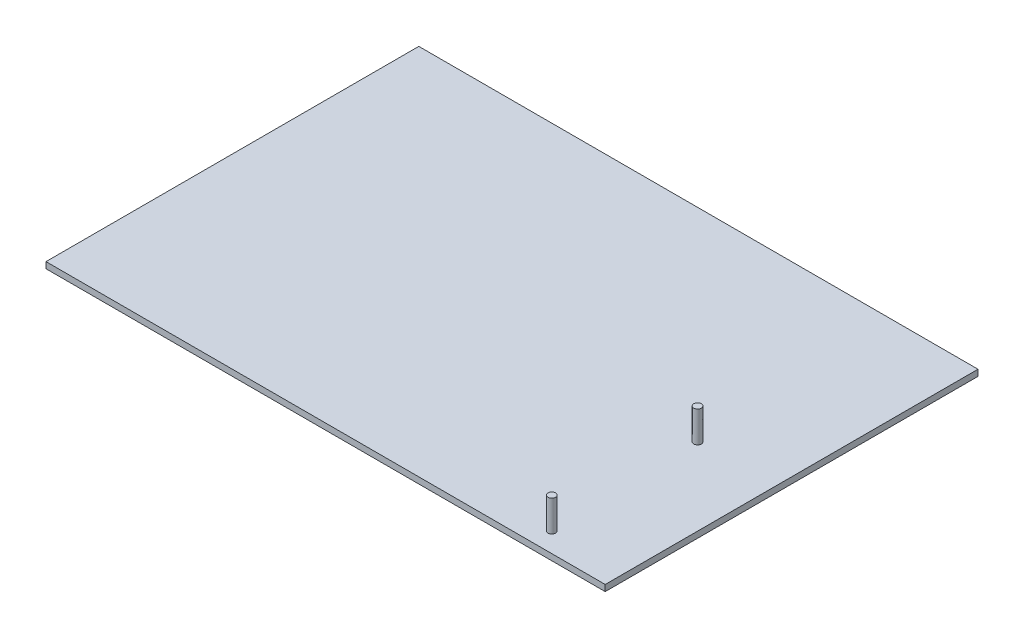
ISO-10303-21;
HEADER;
FILE_DESCRIPTION(('STEP AP214'),'2;1');
FILE_NAME('part.step','',(''),(''),'','','');
FILE_SCHEMA(('AUTOMOTIVE_DESIGN { 1 0 10303 214 1 1 1 1 }'));
ENDSEC;
DATA;
#1=APPLICATION_CONTEXT('core data for automotive mechanical design processes');
#2=APPLICATION_PROTOCOL_DEFINITION('international standard','automotive_design',2000,#1);
#3=PRODUCT_CONTEXT('',#1,'mechanical');
#4=PRODUCT('Part','Part','',(#3));
#5=PRODUCT_RELATED_PRODUCT_CATEGORY('part','',(#4));
#6=PRODUCT_DEFINITION_FORMATION('','',#4);
#7=PRODUCT_DEFINITION_CONTEXT('part definition',#1,'design');
#8=PRODUCT_DEFINITION('design','',#6,#7);
#9=PRODUCT_DEFINITION_SHAPE('','',#8);
#10=(LENGTH_UNIT() NAMED_UNIT(*) SI_UNIT(.MILLI.,.METRE.));
#11=(NAMED_UNIT(*) PLANE_ANGLE_UNIT() SI_UNIT($,.RADIAN.));
#12=(NAMED_UNIT(*) SI_UNIT($,.STERADIAN.) SOLID_ANGLE_UNIT());
#13=UNCERTAINTY_MEASURE_WITH_UNIT(LENGTH_MEASURE(1.E-05),#10,'distance_accuracy_value','');
#14=(GEOMETRIC_REPRESENTATION_CONTEXT(3) GLOBAL_UNCERTAINTY_ASSIGNED_CONTEXT((#13)) GLOBAL_UNIT_ASSIGNED_CONTEXT((#10,
#11,#12)) REPRESENTATION_CONTEXT('',''));
#15=CARTESIAN_POINT('',(0.,0.,0.));
#16=DIRECTION('',(0.,0.,1.));
#17=DIRECTION('',(1.,0.,0.));
#18=AXIS2_PLACEMENT_3D('',#15,#16,#17);
#19=CARTESIAN_POINT('',(90.,2.,60.));
#20=DIRECTION('',(-1.,0.,0.));
#21=DIRECTION('',(0.,0.,1.));
#22=AXIS2_PLACEMENT_3D('',#19,#20,#21);
#23=PLANE('',#22);
#24=DIRECTION('',(0.,0.,-1.));
#25=VECTOR('',#24,1.);
#26=CARTESIAN_POINT('',(90.,0.,60.));
#27=LINE('',#26,#25);
#28=CARTESIAN_POINT('',(90.,0.,60.));
#29=VERTEX_POINT('',#28);
#30=CARTESIAN_POINT('',(90.,0.,-60.));
#31=VERTEX_POINT('',#30);
#32=EDGE_CURVE('E111',#29,#31,#27,.T.);
#33=ORIENTED_EDGE('',*,*,#32,.T.);
#34=DIRECTION('',(0.,-1.,0.));
#35=VECTOR('',#34,1.);
#36=CARTESIAN_POINT('',(90.,2.,-60.));
#37=LINE('',#36,#35);
#38=CARTESIAN_POINT('',(90.,2.,-60.));
#39=VERTEX_POINT('',#38);
#40=EDGE_CURVE('E100',#39,#31,#37,.T.);
#41=ORIENTED_EDGE('',*,*,#40,.F.);
#42=DIRECTION('',(0.,0.,-1.));
#43=VECTOR('',#42,1.);
#44=CARTESIAN_POINT('',(90.,2.,60.));
#45=LINE('',#44,#43);
#46=CARTESIAN_POINT('',(90.,2.,60.));
#47=VERTEX_POINT('',#46);
#48=EDGE_CURVE('E92',#47,#39,#45,.T.);
#49=ORIENTED_EDGE('',*,*,#48,.F.);
#50=DIRECTION('',(0.,-1.,0.));
#51=VECTOR('',#50,1.);
#52=CARTESIAN_POINT('',(90.,2.,60.));
#53=LINE('',#52,#51);
#54=EDGE_CURVE('E107',#47,#29,#53,.T.);
#55=ORIENTED_EDGE('',*,*,#54,.T.);
#56=EDGE_LOOP('',(#33,#41,#49,#55));
#57=FACE_BOUND('',#56,.T.);
#58=ADVANCED_FACE('F39',(#57),#23,.F.);
#59=CARTESIAN_POINT('',(-90.,2.,-60.));
#60=DIRECTION('',(0.,0.,1.));
#61=DIRECTION('',(1.,0.,0.));
#62=AXIS2_PLACEMENT_3D('',#59,#60,#61);
#63=PLANE('',#62);
#64=DIRECTION('',(-1.,0.,0.));
#65=VECTOR('',#64,1.);
#66=CARTESIAN_POINT('',(-90.,0.,-60.));
#67=LINE('',#66,#65);
#68=CARTESIAN_POINT('',(-90.,0.,-60.));
#69=VERTEX_POINT('',#68);
#70=EDGE_CURVE('E98',#31,#69,#67,.T.);
#71=ORIENTED_EDGE('',*,*,#70,.T.);
#72=DIRECTION('',(0.,-1.,0.));
#73=VECTOR('',#72,1.);
#74=CARTESIAN_POINT('',(-90.,2.,-60.));
#75=LINE('',#74,#73);
#76=CARTESIAN_POINT('',(-90.,2.,-60.));
#77=VERTEX_POINT('',#76);
#78=EDGE_CURVE('E96',#77,#69,#75,.T.);
#79=ORIENTED_EDGE('',*,*,#78,.F.);
#80=DIRECTION('',(-1.,0.,0.));
#81=VECTOR('',#80,1.);
#82=CARTESIAN_POINT('',(-90.,2.,-60.));
#83=LINE('',#82,#81);
#84=EDGE_CURVE('E87',#39,#77,#83,.T.);
#85=ORIENTED_EDGE('',*,*,#84,.F.);
#86=ORIENTED_EDGE('',*,*,#40,.T.);
#87=EDGE_LOOP('',(#71,#79,#85,#86));
#88=FACE_BOUND('',#87,.T.);
#89=ADVANCED_FACE('F97',(#88),#63,.F.);
#90=CARTESIAN_POINT('',(-90.,2.,60.));
#91=DIRECTION('',(1.,0.,0.));
#92=DIRECTION('',(0.,0.,-1.));
#93=AXIS2_PLACEMENT_3D('',#90,#91,#92);
#94=PLANE('',#93);
#95=DIRECTION('',(0.,0.,1.));
#96=VECTOR('',#95,1.);
#97=CARTESIAN_POINT('',(-90.,0.,60.));
#98=LINE('',#97,#96);
#99=CARTESIAN_POINT('',(-90.,0.,60.));
#100=VERTEX_POINT('',#99);
#101=EDGE_CURVE('E73',#69,#100,#98,.T.);
#102=ORIENTED_EDGE('',*,*,#101,.T.);
#103=DIRECTION('',(0.,-1.,0.));
#104=VECTOR('',#103,1.);
#105=CARTESIAN_POINT('',(-90.,2.,60.));
#106=LINE('',#105,#104);
#107=CARTESIAN_POINT('',(-90.,2.,60.));
#108=VERTEX_POINT('',#107);
#109=EDGE_CURVE('E101',#108,#100,#106,.T.);
#110=ORIENTED_EDGE('',*,*,#109,.F.);
#111=DIRECTION('',(0.,0.,1.));
#112=VECTOR('',#111,1.);
#113=CARTESIAN_POINT('',(-90.,2.,60.));
#114=LINE('',#113,#112);
#115=EDGE_CURVE('E90',#77,#108,#114,.T.);
#116=ORIENTED_EDGE('',*,*,#115,.F.);
#117=ORIENTED_EDGE('',*,*,#78,.T.);
#118=EDGE_LOOP('',(#102,#110,#116,#117));
#119=FACE_BOUND('',#118,.T.);
#120=ADVANCED_FACE('F103',(#119),#94,.F.);
#121=CARTESIAN_POINT('',(-90.,2.,60.));
#122=DIRECTION('',(0.,0.,-1.));
#123=DIRECTION('',(-1.,0.,0.));
#124=AXIS2_PLACEMENT_3D('',#121,#122,#123);
#125=PLANE('',#124);
#126=DIRECTION('',(1.,0.,0.));
#127=VECTOR('',#126,1.);
#128=CARTESIAN_POINT('',(-90.,0.,60.));
#129=LINE('',#128,#127);
#130=EDGE_CURVE('E79',#100,#29,#129,.T.);
#131=ORIENTED_EDGE('',*,*,#130,.T.);
#132=ORIENTED_EDGE('',*,*,#54,.F.);
#133=DIRECTION('',(1.,0.,0.));
#134=VECTOR('',#133,1.);
#135=CARTESIAN_POINT('',(-90.,2.,60.));
#136=LINE('',#135,#134);
#137=EDGE_CURVE('E56',#108,#47,#136,.T.);
#138=ORIENTED_EDGE('',*,*,#137,.F.);
#139=ORIENTED_EDGE('',*,*,#109,.T.);
#140=EDGE_LOOP('',(#131,#132,#138,#139));
#141=FACE_BOUND('',#140,.T.);
#142=ADVANCED_FACE('F135',(#141),#125,.F.);
#143=CARTESIAN_POINT('',(0.,2.,0.));
#144=DIRECTION('',(0.,-1.,0.));
#145=DIRECTION('',(0.,0.,-1.));
#146=AXIS2_PLACEMENT_3D('',#143,#144,#145);
#147=PLANE('',#146);
#148=CARTESIAN_POINT('',(65.1,2.,5.37000000000001));
#149=DIRECTION('',(0.,-1.,0.));
#150=DIRECTION('',(0.,0.,-1.));
#151=AXIS2_PLACEMENT_3D('',#148,#149,#150);
#152=CIRCLE('',#151,1.225);
#153=CARTESIAN_POINT('',(65.1,2.,4.14500000000001));
#154=VERTEX_POINT('',#153);
#155=EDGE_CURVE('E11',#154,#154,#152,.F.);
#156=ORIENTED_EDGE('',*,*,#155,.F.);
#157=EDGE_LOOP('',(#156));
#158=FACE_BOUND('',#157,.T.);
#159=CARTESIAN_POINT('',(66.5,2.,53.67));
#160=DIRECTION('',(0.,-1.,0.));
#161=DIRECTION('',(0.,0.,-1.));
#162=AXIS2_PLACEMENT_3D('',#159,#160,#161);
#163=CIRCLE('',#162,1.225);
#164=CARTESIAN_POINT('',(66.5,2.,52.445));
#165=VERTEX_POINT('',#164);
#166=EDGE_CURVE('E48',#165,#165,#163,.F.);
#167=ORIENTED_EDGE('',*,*,#166,.F.);
#168=EDGE_LOOP('',(#167));
#169=FACE_BOUND('',#168,.T.);
#170=ORIENTED_EDGE('',*,*,#48,.T.);
#171=ORIENTED_EDGE('',*,*,#84,.T.);
#172=ORIENTED_EDGE('',*,*,#115,.T.);
#173=ORIENTED_EDGE('',*,*,#137,.T.);
#174=EDGE_LOOP('',(#170,#171,#172,#173));
#175=FACE_BOUND('',#174,.T.);
#176=ADVANCED_FACE('F88',(#158,#169,#175),#147,.F.);
#177=CARTESIAN_POINT('',(0.,0.,0.));
#178=DIRECTION('',(0.,-1.,0.));
#179=DIRECTION('',(0.,0.,-1.));
#180=AXIS2_PLACEMENT_3D('',#177,#178,#179);
#181=PLANE('',#180);
#182=ORIENTED_EDGE('',*,*,#32,.F.);
#183=ORIENTED_EDGE('',*,*,#130,.F.);
#184=ORIENTED_EDGE('',*,*,#101,.F.);
#185=ORIENTED_EDGE('',*,*,#70,.F.);
#186=EDGE_LOOP('',(#182,#183,#184,#185));
#187=FACE_BOUND('',#186,.T.);
#188=ADVANCED_FACE('F134',(#187),#181,.T.);
#189=CARTESIAN_POINT('',(66.5,12.,53.67));
#190=DIRECTION('',(0.,-1.,0.));
#191=DIRECTION('',(0.,0.,-1.));
#192=AXIS2_PLACEMENT_3D('',#189,#190,#191);
#193=CYLINDRICAL_SURFACE('',#192,1.225);
#194=CARTESIAN_POINT('',(66.5,12.,53.67));
#195=DIRECTION('',(0.,1.,0.));
#196=DIRECTION('',(0.,0.,1.));
#197=AXIS2_PLACEMENT_3D('',#194,#195,#196);
#198=CIRCLE('',#197,1.225);
#199=CARTESIAN_POINT('',(66.5,12.,54.895));
#200=VERTEX_POINT('',#199);
#201=EDGE_CURVE('E115',#200,#200,#198,.T.);
#202=ORIENTED_EDGE('',*,*,#201,.F.);
#203=EDGE_LOOP('',(#202));
#204=FACE_BOUND('',#203,.T.);
#205=ORIENTED_EDGE('',*,*,#166,.T.);
#206=EDGE_LOOP('',(#205));
#207=FACE_BOUND('',#206,.T.);
#208=ADVANCED_FACE('F131',(#204,#207),#193,.T.);
#209=CARTESIAN_POINT('',(66.5,12.,53.67));
#210=DIRECTION('',(0.,1.,0.));
#211=DIRECTION('',(0.,0.,1.));
#212=AXIS2_PLACEMENT_3D('',#209,#210,#211);
#213=PLANE('',#212);
#214=ORIENTED_EDGE('',*,*,#201,.T.);
#215=EDGE_LOOP('',(#214));
#216=FACE_BOUND('',#215,.T.);
#217=ADVANCED_FACE('F168',(#216),#213,.T.);
#218=CARTESIAN_POINT('',(65.1,12.,5.37000000000001));
#219=DIRECTION('',(0.,-1.,0.));
#220=DIRECTION('',(0.,0.,-1.));
#221=AXIS2_PLACEMENT_3D('',#218,#219,#220);
#222=CYLINDRICAL_SURFACE('',#221,1.225);
#223=CARTESIAN_POINT('',(65.1,12.,5.37000000000001));
#224=DIRECTION('',(0.,1.,0.));
#225=DIRECTION('',(0.,0.,1.));
#226=AXIS2_PLACEMENT_3D('',#223,#224,#225);
#227=CIRCLE('',#226,1.225);
#228=CARTESIAN_POINT('',(65.1,12.,6.59500000000001));
#229=VERTEX_POINT('',#228);
#230=EDGE_CURVE('E158',#229,#229,#227,.T.);
#231=ORIENTED_EDGE('',*,*,#230,.F.);
#232=EDGE_LOOP('',(#231));
#233=FACE_BOUND('',#232,.T.);
#234=ORIENTED_EDGE('',*,*,#155,.T.);
#235=EDGE_LOOP('',(#234));
#236=FACE_BOUND('',#235,.T.);
#237=ADVANCED_FACE('F165',(#233,#236),#222,.T.);
#238=CARTESIAN_POINT('',(65.1,12.,5.37000000000001));
#239=DIRECTION('',(0.,1.,0.));
#240=DIRECTION('',(0.,0.,1.));
#241=AXIS2_PLACEMENT_3D('',#238,#239,#240);
#242=PLANE('',#241);
#243=ORIENTED_EDGE('',*,*,#230,.T.);
#244=EDGE_LOOP('',(#243));
#245=FACE_BOUND('',#244,.T.);
#246=ADVANCED_FACE('F163',(#245),#242,.T.);
#247=CLOSED_SHELL('',(#58,#89,#120,#142,#176,#188,#208,#217,#237,#246));
#248=MANIFOLD_SOLID_BREP('B2',#247);
#249=ADVANCED_BREP_SHAPE_REPRESENTATION('',(#18,#248),#14);
#250=SHAPE_DEFINITION_REPRESENTATION(#9,#249);
ENDSEC;
END-ISO-10303-21;
